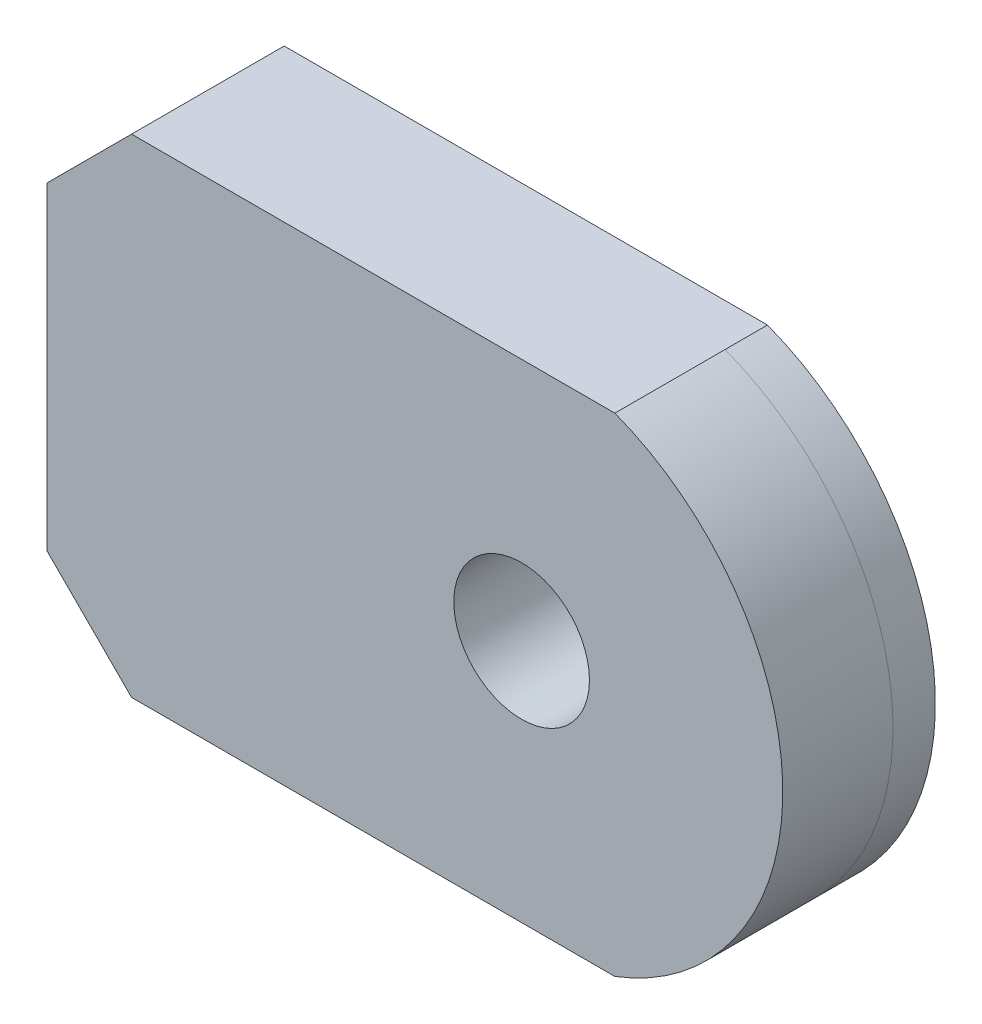
ISO-10303-21;
HEADER;
FILE_DESCRIPTION(('STEP AP214'),'2;1');
FILE_NAME('part.step','',(''),(''),'','','');
FILE_SCHEMA(('AUTOMOTIVE_DESIGN { 1 0 10303 214 1 1 1 1 }'));
ENDSEC;
DATA;
#1=APPLICATION_CONTEXT('core data for automotive mechanical design processes');
#2=APPLICATION_PROTOCOL_DEFINITION('international standard','automotive_design',2000,#1);
#3=PRODUCT_CONTEXT('',#1,'mechanical');
#4=PRODUCT('Part','Part','',(#3));
#5=PRODUCT_RELATED_PRODUCT_CATEGORY('part','',(#4));
#6=PRODUCT_DEFINITION_FORMATION('','',#4);
#7=PRODUCT_DEFINITION_CONTEXT('part definition',#1,'design');
#8=PRODUCT_DEFINITION('design','',#6,#7);
#9=PRODUCT_DEFINITION_SHAPE('','',#8);
#10=(LENGTH_UNIT() NAMED_UNIT(*) SI_UNIT(.MILLI.,.METRE.));
#11=(NAMED_UNIT(*) PLANE_ANGLE_UNIT() SI_UNIT($,.RADIAN.));
#12=(NAMED_UNIT(*) SI_UNIT($,.STERADIAN.) SOLID_ANGLE_UNIT());
#13=UNCERTAINTY_MEASURE_WITH_UNIT(LENGTH_MEASURE(1.E-05),#10,'distance_accuracy_value','');
#14=(GEOMETRIC_REPRESENTATION_CONTEXT(3) GLOBAL_UNCERTAINTY_ASSIGNED_CONTEXT((#13)) GLOBAL_UNIT_ASSIGNED_CONTEXT((#10,
#11,#12)) REPRESENTATION_CONTEXT('',''));
#15=CARTESIAN_POINT('',(0.,0.,0.));
#16=DIRECTION('',(0.,0.,1.));
#17=DIRECTION('',(1.,0.,0.));
#18=AXIS2_PLACEMENT_3D('',#15,#16,#17);
#19=CARTESIAN_POINT('',(28.,14.385,0.));
#20=DIRECTION('',(0.,0.,1.));
#21=DIRECTION('',(1.,0.,0.));
#22=AXIS2_PLACEMENT_3D('',#19,#20,#21);
#23=PLANE('',#22);
#24=DIRECTION('',(-0.707106781186547,-0.707106781186548,0.));
#25=VECTOR('',#24,1.);
#26=CARTESIAN_POINT('',(5.,28.77,0.));
#27=LINE('',#26,#25);
#28=CARTESIAN_POINT('',(5.,28.77,0.));
#29=VERTEX_POINT('',#28);
#30=CARTESIAN_POINT('',(0.,23.77,0.));
#31=VERTEX_POINT('',#30);
#32=EDGE_CURVE('E94',#29,#31,#27,.T.);
#33=ORIENTED_EDGE('',*,*,#32,.F.);
#34=DIRECTION('',(-1.,0.,0.));
#35=VECTOR('',#34,1.);
#36=CARTESIAN_POINT('',(22.5,28.77,0.));
#37=LINE('',#36,#35);
#38=CARTESIAN_POINT('',(33.5,28.77,0.));
#39=VERTEX_POINT('',#38);
#40=EDGE_CURVE('E78',#39,#29,#37,.T.);
#41=ORIENTED_EDGE('',*,*,#40,.F.);
#42=CARTESIAN_POINT('',(28.,14.385,0.));
#43=DIRECTION('',(0.,0.,1.));
#44=DIRECTION('',(1.,0.,0.));
#45=AXIS2_PLACEMENT_3D('',#42,#43,#44);
#46=CIRCLE('',#45,15.4005917094117);
#47=CARTESIAN_POINT('',(33.5,0.,0.));
#48=VERTEX_POINT('',#47);
#49=EDGE_CURVE('E88',#48,#39,#46,.T.);
#50=ORIENTED_EDGE('',*,*,#49,.F.);
#51=DIRECTION('',(1.,0.,0.));
#52=VECTOR('',#51,1.);
#53=CARTESIAN_POINT('',(22.5,0.,0.));
#54=LINE('',#53,#52);
#55=CARTESIAN_POINT('',(5.,0.,0.));
#56=VERTEX_POINT('',#55);
#57=EDGE_CURVE('E112',#56,#48,#54,.T.);
#58=ORIENTED_EDGE('',*,*,#57,.F.);
#59=DIRECTION('',(0.707106781186548,-0.707106781186547,0.));
#60=VECTOR('',#59,1.);
#61=CARTESIAN_POINT('',(0.,5.,0.));
#62=LINE('',#61,#60);
#63=CARTESIAN_POINT('',(0.,5.,0.));
#64=VERTEX_POINT('',#63);
#65=EDGE_CURVE('E103',#64,#56,#62,.T.);
#66=ORIENTED_EDGE('',*,*,#65,.F.);
#67=DIRECTION('',(0.,-1.,0.));
#68=VECTOR('',#67,1.);
#69=CARTESIAN_POINT('',(0.,23.77,0.));
#70=LINE('',#69,#68);
#71=EDGE_CURVE('E100',#31,#64,#70,.T.);
#72=ORIENTED_EDGE('',*,*,#71,.F.);
#73=EDGE_LOOP('',(#33,#41,#50,#58,#66,#72));
#74=FACE_BOUND('',#73,.T.);
#75=CARTESIAN_POINT('',(12.25,3.905,0.));
#76=DIRECTION('',(0.,0.,1.));
#77=DIRECTION('',(1.,0.,0.));
#78=AXIS2_PLACEMENT_3D('',#75,#76,#77);
#79=CIRCLE('',#78,1.98);
#80=CARTESIAN_POINT('',(14.23,3.905,0.));
#81=VERTEX_POINT('',#80);
#82=EDGE_CURVE('E101',#81,#81,#79,.T.);
#83=ORIENTED_EDGE('',*,*,#82,.T.);
#84=EDGE_LOOP('',(#83));
#85=FACE_BOUND('',#84,.T.);
#86=CARTESIAN_POINT('',(12.25,24.865,0.));
#87=DIRECTION('',(0.,0.,1.));
#88=DIRECTION('',(1.,0.,0.));
#89=AXIS2_PLACEMENT_3D('',#86,#87,#88);
#90=CIRCLE('',#89,1.98);
#91=CARTESIAN_POINT('',(14.23,24.865,0.));
#92=VERTEX_POINT('',#91);
#93=EDGE_CURVE('E106',#92,#92,#90,.T.);
#94=ORIENTED_EDGE('',*,*,#93,.T.);
#95=EDGE_LOOP('',(#94));
#96=FACE_BOUND('',#95,.T.);
#97=CARTESIAN_POINT('',(28.,14.385,0.));
#98=DIRECTION('',(0.,0.,1.));
#99=DIRECTION('',(1.,0.,0.));
#100=AXIS2_PLACEMENT_3D('',#97,#98,#99);
#101=CIRCLE('',#100,6.3);
#102=CARTESIAN_POINT('',(34.3,14.385,0.));
#103=VERTEX_POINT('',#102);
#104=EDGE_CURVE('E287',#103,#103,#101,.T.);
#105=ORIENTED_EDGE('',*,*,#104,.T.);
#106=EDGE_LOOP('',(#105));
#107=FACE_BOUND('',#106,.T.);
#108=CARTESIAN_POINT('',(28.,23.91,0.));
#109=DIRECTION('',(0.,0.,1.));
#110=DIRECTION('',(1.,0.,0.));
#111=AXIS2_PLACEMENT_3D('',#108,#109,#110);
#112=CIRCLE('',#111,1.475);
#113=CARTESIAN_POINT('',(29.475,23.91,0.));
#114=VERTEX_POINT('',#113);
#115=EDGE_CURVE('E284',#114,#114,#112,.T.);
#116=ORIENTED_EDGE('',*,*,#115,.T.);
#117=EDGE_LOOP('',(#116));
#118=FACE_BOUND('',#117,.T.);
#119=CARTESIAN_POINT('',(28.,4.86,0.));
#120=DIRECTION('',(0.,0.,1.));
#121=DIRECTION('',(1.,0.,0.));
#122=AXIS2_PLACEMENT_3D('',#119,#120,#121);
#123=CIRCLE('',#122,1.475);
#124=CARTESIAN_POINT('',(29.475,4.86,0.));
#125=VERTEX_POINT('',#124);
#126=EDGE_CURVE('E281',#125,#125,#123,.T.);
#127=ORIENTED_EDGE('',*,*,#126,.T.);
#128=EDGE_LOOP('',(#127));
#129=FACE_BOUND('',#128,.T.);
#130=CARTESIAN_POINT('',(36.9802561210691,5.40474387893083,0.));
#131=DIRECTION('',(0.,0.,1.));
#132=DIRECTION('',(1.,0.,0.));
#133=AXIS2_PLACEMENT_3D('',#130,#131,#132);
#134=CIRCLE('',#133,1.05);
#135=CARTESIAN_POINT('',(38.0302561210691,5.40474387893083,0.));
#136=VERTEX_POINT('',#135);
#137=EDGE_CURVE('E278',#136,#136,#134,.T.);
#138=ORIENTED_EDGE('',*,*,#137,.T.);
#139=EDGE_LOOP('',(#138));
#140=FACE_BOUND('',#139,.T.);
#141=CARTESIAN_POINT('',(36.9802561210691,23.3652561210692,0.));
#142=DIRECTION('',(0.,0.,1.));
#143=DIRECTION('',(1.,0.,0.));
#144=AXIS2_PLACEMENT_3D('',#141,#142,#143);
#145=CIRCLE('',#144,1.05);
#146=CARTESIAN_POINT('',(38.0302561210691,23.3652561210692,0.));
#147=VERTEX_POINT('',#146);
#148=EDGE_CURVE('E275',#147,#147,#145,.T.);
#149=ORIENTED_EDGE('',*,*,#148,.T.);
#150=EDGE_LOOP('',(#149));
#151=FACE_BOUND('',#150,.T.);
#152=CARTESIAN_POINT('',(19.0197438789308,23.3652561210692,0.));
#153=DIRECTION('',(0.,0.,1.));
#154=DIRECTION('',(1.,0.,0.));
#155=AXIS2_PLACEMENT_3D('',#152,#153,#154);
#156=CIRCLE('',#155,1.05);
#157=CARTESIAN_POINT('',(20.0697438789309,23.3652561210692,0.));
#158=VERTEX_POINT('',#157);
#159=EDGE_CURVE('E272',#158,#158,#156,.T.);
#160=ORIENTED_EDGE('',*,*,#159,.T.);
#161=EDGE_LOOP('',(#160));
#162=FACE_BOUND('',#161,.T.);
#163=CARTESIAN_POINT('',(19.0197438789308,5.40474387893083,0.));
#164=DIRECTION('',(0.,0.,1.));
#165=DIRECTION('',(1.,0.,0.));
#166=AXIS2_PLACEMENT_3D('',#163,#164,#165);
#167=CIRCLE('',#166,1.05);
#168=CARTESIAN_POINT('',(20.0697438789309,5.40474387893083,0.));
#169=VERTEX_POINT('',#168);
#170=EDGE_CURVE('E269',#169,#169,#167,.T.);
#171=ORIENTED_EDGE('',*,*,#170,.T.);
#172=EDGE_LOOP('',(#171));
#173=FACE_BOUND('',#172,.T.);
#174=CARTESIAN_POINT('',(24.,21.3132032302755,0.));
#175=DIRECTION('',(0.,0.,1.));
#176=DIRECTION('',(1.,0.,0.));
#177=AXIS2_PLACEMENT_3D('',#174,#175,#176);
#178=CIRCLE('',#177,0.85);
#179=CARTESIAN_POINT('',(24.85,21.3132032302755,0.));
#180=VERTEX_POINT('',#179);
#181=EDGE_CURVE('E266',#180,#180,#178,.T.);
#182=ORIENTED_EDGE('',*,*,#181,.T.);
#183=EDGE_LOOP('',(#182));
#184=FACE_BOUND('',#183,.T.);
#185=CARTESIAN_POINT('',(32.,7.45679676972446,0.));
#186=DIRECTION('',(0.,0.,1.));
#187=DIRECTION('',(1.,0.,0.));
#188=AXIS2_PLACEMENT_3D('',#185,#186,#187);
#189=CIRCLE('',#188,0.85);
#190=CARTESIAN_POINT('',(32.85,7.45679676972446,0.));
#191=VERTEX_POINT('',#190);
#192=EDGE_CURVE('E263',#191,#191,#189,.T.);
#193=ORIENTED_EDGE('',*,*,#192,.T.);
#194=EDGE_LOOP('',(#193));
#195=FACE_BOUND('',#194,.T.);
#196=ADVANCED_FACE('F35',(#74,#85,#96,#107,#118,#129,#140,#151,#162,#173,#184,#195),#23,.F.);
#197=CARTESIAN_POINT('',(5.,28.77,2.5));
#198=DIRECTION('',(0.707106781186548,-0.707106781186547,0.));
#199=DIRECTION('',(0.707106781186547,0.707106781186548,0.));
#200=AXIS2_PLACEMENT_3D('',#197,#198,#199);
#201=PLANE('',#200);
#202=ORIENTED_EDGE('',*,*,#32,.T.);
#203=DIRECTION('',(0.,0.,-1.));
#204=VECTOR('',#203,1.);
#205=CARTESIAN_POINT('',(0.,23.77,2.5));
#206=LINE('',#205,#204);
#207=CARTESIAN_POINT('',(0.,23.77,9.));
#208=VERTEX_POINT('',#207);
#209=EDGE_CURVE('E11',#208,#31,#206,.T.);
#210=ORIENTED_EDGE('',*,*,#209,.F.);
#211=DIRECTION('',(-0.707106781186547,-0.707106781186548,0.));
#212=VECTOR('',#211,1.);
#213=CARTESIAN_POINT('',(5.,28.77,9.));
#214=LINE('',#213,#212);
#215=CARTESIAN_POINT('',(5.,28.77,9.));
#216=VERTEX_POINT('',#215);
#217=EDGE_CURVE('E96',#216,#208,#214,.T.);
#218=ORIENTED_EDGE('',*,*,#217,.F.);
#219=DIRECTION('',(0.,0.,-1.));
#220=VECTOR('',#219,1.);
#221=CARTESIAN_POINT('',(5.,28.77,2.5));
#222=LINE('',#221,#220);
#223=EDGE_CURVE('E84',#216,#29,#222,.T.);
#224=ORIENTED_EDGE('',*,*,#223,.T.);
#225=EDGE_LOOP('',(#202,#210,#218,#224));
#226=FACE_BOUND('',#225,.T.);
#227=ADVANCED_FACE('F37',(#226),#201,.F.);
#228=CARTESIAN_POINT('',(0.,23.77,2.5));
#229=DIRECTION('',(1.,0.,0.));
#230=DIRECTION('',(0.,1.,0.));
#231=AXIS2_PLACEMENT_3D('',#228,#229,#230);
#232=PLANE('',#231);
#233=ORIENTED_EDGE('',*,*,#71,.T.);
#234=DIRECTION('',(0.,0.,-1.));
#235=VECTOR('',#234,1.);
#236=CARTESIAN_POINT('',(0.,5.,2.5));
#237=LINE('',#236,#235);
#238=CARTESIAN_POINT('',(0.,5.,9.));
#239=VERTEX_POINT('',#238);
#240=EDGE_CURVE('E45',#239,#64,#237,.T.);
#241=ORIENTED_EDGE('',*,*,#240,.F.);
#242=DIRECTION('',(0.,-1.,0.));
#243=VECTOR('',#242,1.);
#244=CARTESIAN_POINT('',(0.,5.,9.));
#245=LINE('',#244,#243);
#246=EDGE_CURVE('E390',#208,#239,#245,.T.);
#247=ORIENTED_EDGE('',*,*,#246,.F.);
#248=ORIENTED_EDGE('',*,*,#209,.T.);
#249=EDGE_LOOP('',(#233,#241,#247,#248));
#250=FACE_BOUND('',#249,.T.);
#251=ADVANCED_FACE('F146',(#250),#232,.F.);
#252=CARTESIAN_POINT('',(0.,5.,2.5));
#253=DIRECTION('',(0.707106781186547,0.707106781186548,0.));
#254=DIRECTION('',(-0.707106781186548,0.707106781186547,0.));
#255=AXIS2_PLACEMENT_3D('',#252,#253,#254);
#256=PLANE('',#255);
#257=ORIENTED_EDGE('',*,*,#65,.T.);
#258=DIRECTION('',(0.,0.,-1.));
#259=VECTOR('',#258,1.);
#260=CARTESIAN_POINT('',(5.,0.,2.5));
#261=LINE('',#260,#259);
#262=CARTESIAN_POINT('',(5.,0.,9.));
#263=VERTEX_POINT('',#262);
#264=EDGE_CURVE('E115',#263,#56,#261,.T.);
#265=ORIENTED_EDGE('',*,*,#264,.F.);
#266=DIRECTION('',(0.707106781186548,-0.707106781186547,0.));
#267=VECTOR('',#266,1.);
#268=CARTESIAN_POINT('',(5.,0.,9.));
#269=LINE('',#268,#267);
#270=EDGE_CURVE('E397',#239,#263,#269,.T.);
#271=ORIENTED_EDGE('',*,*,#270,.F.);
#272=ORIENTED_EDGE('',*,*,#240,.T.);
#273=EDGE_LOOP('',(#257,#265,#271,#272));
#274=FACE_BOUND('',#273,.T.);
#275=ADVANCED_FACE('F143',(#274),#256,.F.);
#276=CARTESIAN_POINT('',(22.5,0.,2.5));
#277=DIRECTION('',(0.,1.,0.));
#278=DIRECTION('',(0.,0.,1.));
#279=AXIS2_PLACEMENT_3D('',#276,#277,#278);
#280=PLANE('',#279);
#281=ORIENTED_EDGE('',*,*,#57,.T.);
#282=DIRECTION('',(0.,0.,-1.));
#283=VECTOR('',#282,1.);
#284=CARTESIAN_POINT('',(33.5,0.,2.5));
#285=LINE('',#284,#283);
#286=CARTESIAN_POINT('',(33.5,0.,2.5));
#287=VERTEX_POINT('',#286);
#288=EDGE_CURVE('E118',#287,#48,#285,.T.);
#289=ORIENTED_EDGE('',*,*,#288,.F.);
#290=DIRECTION('',(0.,0.,-1.));
#291=VECTOR('',#290,1.);
#292=CARTESIAN_POINT('',(33.5,0.,9.));
#293=LINE('',#292,#291);
#294=CARTESIAN_POINT('',(33.5,0.,9.));
#295=VERTEX_POINT('',#294);
#296=EDGE_CURVE('E216',#295,#287,#293,.T.);
#297=ORIENTED_EDGE('',*,*,#296,.F.);
#298=DIRECTION('',(1.,0.,0.));
#299=VECTOR('',#298,1.);
#300=CARTESIAN_POINT('',(33.5,0.,9.));
#301=LINE('',#300,#299);
#302=EDGE_CURVE('E400',#263,#295,#301,.T.);
#303=ORIENTED_EDGE('',*,*,#302,.F.);
#304=ORIENTED_EDGE('',*,*,#264,.T.);
#305=EDGE_LOOP('',(#281,#289,#297,#303,#304));
#306=FACE_BOUND('',#305,.T.);
#307=ADVANCED_FACE('F139',(#306),#280,.F.);
#308=CARTESIAN_POINT('',(28.,14.385,2.5));
#309=DIRECTION('',(0.,0.,-1.));
#310=DIRECTION('',(-1.,0.,0.));
#311=AXIS2_PLACEMENT_3D('',#308,#309,#310);
#312=CYLINDRICAL_SURFACE('',#311,15.4005917094117);
#313=ORIENTED_EDGE('',*,*,#49,.T.);
#314=DIRECTION('',(0.,0.,-1.));
#315=VECTOR('',#314,1.);
#316=CARTESIAN_POINT('',(33.5,28.77,2.5));
#317=LINE('',#316,#315);
#318=CARTESIAN_POINT('',(33.5,28.77,2.5));
#319=VERTEX_POINT('',#318);
#320=EDGE_CURVE('E54',#319,#39,#317,.T.);
#321=ORIENTED_EDGE('',*,*,#320,.F.);
#322=CARTESIAN_POINT('',(27.9998466553482,14.385,2.5));
#323=DIRECTION('',(0.,0.,1.));
#324=DIRECTION('',(0.357137822361272,-0.934051698697159,0.));
#325=AXIS2_PLACEMENT_3D('',#322,#323,#324);
#326=CIRCLE('',#325,15.4006464739207);
#327=EDGE_CURVE('E87',#287,#319,#326,.T.);
#328=ORIENTED_EDGE('',*,*,#327,.F.);
#329=ORIENTED_EDGE('',*,*,#288,.T.);
#330=EDGE_LOOP('',(#313,#321,#328,#329));
#331=FACE_BOUND('',#330,.T.);
#332=ADVANCED_FACE('F129',(#331),#312,.T.);
#333=CARTESIAN_POINT('',(22.5,28.77,2.5));
#334=DIRECTION('',(0.,-1.,0.));
#335=DIRECTION('',(0.,0.,-1.));
#336=AXIS2_PLACEMENT_3D('',#333,#334,#335);
#337=PLANE('',#336);
#338=ORIENTED_EDGE('',*,*,#40,.T.);
#339=ORIENTED_EDGE('',*,*,#223,.F.);
#340=DIRECTION('',(-1.,0.,0.));
#341=VECTOR('',#340,1.);
#342=CARTESIAN_POINT('',(5.,28.77,9.));
#343=LINE('',#342,#341);
#344=CARTESIAN_POINT('',(33.5,28.77,9.));
#345=VERTEX_POINT('',#344);
#346=EDGE_CURVE('E228',#345,#216,#343,.T.);
#347=ORIENTED_EDGE('',*,*,#346,.F.);
#348=DIRECTION('',(0.,0.,-1.));
#349=VECTOR('',#348,1.);
#350=CARTESIAN_POINT('',(33.5,28.77,9.));
#351=LINE('',#350,#349);
#352=EDGE_CURVE('E224',#345,#319,#351,.T.);
#353=ORIENTED_EDGE('',*,*,#352,.T.);
#354=ORIENTED_EDGE('',*,*,#320,.T.);
#355=EDGE_LOOP('',(#338,#339,#347,#353,#354));
#356=FACE_BOUND('',#355,.T.);
#357=ADVANCED_FACE('F82',(#356),#337,.F.);
#358=CARTESIAN_POINT('',(12.25,3.905,2.5));
#359=DIRECTION('',(0.,0.,-1.));
#360=DIRECTION('',(-1.,0.,0.));
#361=AXIS2_PLACEMENT_3D('',#358,#359,#360);
#362=CYLINDRICAL_SURFACE('',#361,1.98);
#363=CARTESIAN_POINT('',(12.25,3.905,2.5));
#364=DIRECTION('',(0.,0.,-1.));
#365=DIRECTION('',(-1.,0.,0.));
#366=AXIS2_PLACEMENT_3D('',#363,#364,#365);
#367=CIRCLE('',#366,1.98);
#368=CARTESIAN_POINT('',(10.27,3.905,2.5));
#369=VERTEX_POINT('',#368);
#370=EDGE_CURVE('E260',#369,#369,#367,.T.);
#371=ORIENTED_EDGE('',*,*,#370,.F.);
#372=EDGE_LOOP('',(#371));
#373=FACE_BOUND('',#372,.T.);
#374=ORIENTED_EDGE('',*,*,#82,.F.);
#375=EDGE_LOOP('',(#374));
#376=FACE_BOUND('',#375,.T.);
#377=ADVANCED_FACE('F157',(#373,#376),#362,.F.);
#378=CARTESIAN_POINT('',(12.25,24.865,2.5));
#379=DIRECTION('',(0.,0.,-1.));
#380=DIRECTION('',(-1.,0.,0.));
#381=AXIS2_PLACEMENT_3D('',#378,#379,#380);
#382=CYLINDRICAL_SURFACE('',#381,1.98);
#383=CARTESIAN_POINT('',(12.25,24.865,2.5));
#384=DIRECTION('',(0.,0.,-1.));
#385=DIRECTION('',(-1.,0.,0.));
#386=AXIS2_PLACEMENT_3D('',#383,#384,#385);
#387=CIRCLE('',#386,1.98);
#388=CARTESIAN_POINT('',(10.27,24.865,2.5));
#389=VERTEX_POINT('',#388);
#390=EDGE_CURVE('E257',#389,#389,#387,.T.);
#391=ORIENTED_EDGE('',*,*,#390,.F.);
#392=EDGE_LOOP('',(#391));
#393=FACE_BOUND('',#392,.T.);
#394=ORIENTED_EDGE('',*,*,#93,.F.);
#395=EDGE_LOOP('',(#394));
#396=FACE_BOUND('',#395,.T.);
#397=ADVANCED_FACE('F160',(#393,#396),#382,.F.);
#398=CARTESIAN_POINT('',(28.,14.385,2.5));
#399=DIRECTION('',(0.,0.,-1.));
#400=DIRECTION('',(-1.,0.,0.));
#401=AXIS2_PLACEMENT_3D('',#398,#399,#400);
#402=CYLINDRICAL_SURFACE('',#401,6.3);
#403=CARTESIAN_POINT('',(28.,14.385,2.5));
#404=DIRECTION('',(0.,0.,-1.));
#405=DIRECTION('',(-1.,0.,0.));
#406=AXIS2_PLACEMENT_3D('',#403,#404,#405);
#407=CIRCLE('',#406,6.3);
#408=CARTESIAN_POINT('',(21.7,14.385,2.5));
#409=VERTEX_POINT('',#408);
#410=EDGE_CURVE('E254',#409,#409,#407,.T.);
#411=ORIENTED_EDGE('',*,*,#410,.F.);
#412=EDGE_LOOP('',(#411));
#413=FACE_BOUND('',#412,.T.);
#414=ORIENTED_EDGE('',*,*,#104,.F.);
#415=EDGE_LOOP('',(#414));
#416=FACE_BOUND('',#415,.T.);
#417=ADVANCED_FACE('F164',(#413,#416),#402,.F.);
#418=CARTESIAN_POINT('',(28.,23.91,2.5));
#419=DIRECTION('',(0.,0.,-1.));
#420=DIRECTION('',(-1.,0.,0.));
#421=AXIS2_PLACEMENT_3D('',#418,#419,#420);
#422=CYLINDRICAL_SURFACE('',#421,1.475);
#423=CARTESIAN_POINT('',(28.,23.91,2.5));
#424=DIRECTION('',(0.,0.,-1.));
#425=DIRECTION('',(-1.,0.,0.));
#426=AXIS2_PLACEMENT_3D('',#423,#424,#425);
#427=CIRCLE('',#426,1.475);
#428=CARTESIAN_POINT('',(26.525,23.91,2.5));
#429=VERTEX_POINT('',#428);
#430=EDGE_CURVE('E251',#429,#429,#427,.T.);
#431=ORIENTED_EDGE('',*,*,#430,.F.);
#432=EDGE_LOOP('',(#431));
#433=FACE_BOUND('',#432,.T.);
#434=ORIENTED_EDGE('',*,*,#115,.F.);
#435=EDGE_LOOP('',(#434));
#436=FACE_BOUND('',#435,.T.);
#437=ADVANCED_FACE('F168',(#433,#436),#422,.F.);
#438=CARTESIAN_POINT('',(28.,4.86,2.5));
#439=DIRECTION('',(0.,0.,-1.));
#440=DIRECTION('',(-1.,0.,0.));
#441=AXIS2_PLACEMENT_3D('',#438,#439,#440);
#442=CYLINDRICAL_SURFACE('',#441,1.475);
#443=CARTESIAN_POINT('',(28.,4.86,2.5));
#444=DIRECTION('',(0.,0.,-1.));
#445=DIRECTION('',(-1.,0.,0.));
#446=AXIS2_PLACEMENT_3D('',#443,#444,#445);
#447=CIRCLE('',#446,1.475);
#448=CARTESIAN_POINT('',(26.525,4.86,2.5));
#449=VERTEX_POINT('',#448);
#450=EDGE_CURVE('E248',#449,#449,#447,.T.);
#451=ORIENTED_EDGE('',*,*,#450,.F.);
#452=EDGE_LOOP('',(#451));
#453=FACE_BOUND('',#452,.T.);
#454=ORIENTED_EDGE('',*,*,#126,.F.);
#455=EDGE_LOOP('',(#454));
#456=FACE_BOUND('',#455,.T.);
#457=ADVANCED_FACE('F172',(#453,#456),#442,.F.);
#458=CARTESIAN_POINT('',(36.9802561210691,5.40474387893083,2.5));
#459=DIRECTION('',(0.,0.,-1.));
#460=DIRECTION('',(-1.,0.,0.));
#461=AXIS2_PLACEMENT_3D('',#458,#459,#460);
#462=CYLINDRICAL_SURFACE('',#461,1.05);
#463=CARTESIAN_POINT('',(36.9802561210691,5.40474387893083,2.5));
#464=DIRECTION('',(0.,0.,-1.));
#465=DIRECTION('',(-1.,0.,0.));
#466=AXIS2_PLACEMENT_3D('',#463,#464,#465);
#467=CIRCLE('',#466,1.05);
#468=CARTESIAN_POINT('',(35.9302561210691,5.40474387893083,2.5));
#469=VERTEX_POINT('',#468);
#470=EDGE_CURVE('E245',#469,#469,#467,.T.);
#471=ORIENTED_EDGE('',*,*,#470,.F.);
#472=EDGE_LOOP('',(#471));
#473=FACE_BOUND('',#472,.T.);
#474=ORIENTED_EDGE('',*,*,#137,.F.);
#475=EDGE_LOOP('',(#474));
#476=FACE_BOUND('',#475,.T.);
#477=ADVANCED_FACE('F176',(#473,#476),#462,.F.);
#478=CARTESIAN_POINT('',(36.9802561210691,23.3652561210692,2.5));
#479=DIRECTION('',(0.,0.,-1.));
#480=DIRECTION('',(-1.,0.,0.));
#481=AXIS2_PLACEMENT_3D('',#478,#479,#480);
#482=CYLINDRICAL_SURFACE('',#481,1.05);
#483=CARTESIAN_POINT('',(36.9802561210691,23.3652561210692,2.5));
#484=DIRECTION('',(0.,0.,-1.));
#485=DIRECTION('',(-1.,0.,0.));
#486=AXIS2_PLACEMENT_3D('',#483,#484,#485);
#487=CIRCLE('',#486,1.05);
#488=CARTESIAN_POINT('',(35.9302561210691,23.3652561210692,2.5));
#489=VERTEX_POINT('',#488);
#490=EDGE_CURVE('E242',#489,#489,#487,.T.);
#491=ORIENTED_EDGE('',*,*,#490,.F.);
#492=EDGE_LOOP('',(#491));
#493=FACE_BOUND('',#492,.T.);
#494=ORIENTED_EDGE('',*,*,#148,.F.);
#495=EDGE_LOOP('',(#494));
#496=FACE_BOUND('',#495,.T.);
#497=ADVANCED_FACE('F180',(#493,#496),#482,.F.);
#498=CARTESIAN_POINT('',(19.0197438789308,23.3652561210692,2.5));
#499=DIRECTION('',(0.,0.,-1.));
#500=DIRECTION('',(-1.,0.,0.));
#501=AXIS2_PLACEMENT_3D('',#498,#499,#500);
#502=CYLINDRICAL_SURFACE('',#501,1.05);
#503=CARTESIAN_POINT('',(19.0197438789308,23.3652561210692,2.5));
#504=DIRECTION('',(0.,0.,-1.));
#505=DIRECTION('',(-1.,0.,0.));
#506=AXIS2_PLACEMENT_3D('',#503,#504,#505);
#507=CIRCLE('',#506,1.05);
#508=CARTESIAN_POINT('',(17.9697438789309,23.3652561210692,2.5));
#509=VERTEX_POINT('',#508);
#510=EDGE_CURVE('E239',#509,#509,#507,.T.);
#511=ORIENTED_EDGE('',*,*,#510,.F.);
#512=EDGE_LOOP('',(#511));
#513=FACE_BOUND('',#512,.T.);
#514=ORIENTED_EDGE('',*,*,#159,.F.);
#515=EDGE_LOOP('',(#514));
#516=FACE_BOUND('',#515,.T.);
#517=ADVANCED_FACE('F184',(#513,#516),#502,.F.);
#518=CARTESIAN_POINT('',(19.0197438789308,5.40474387893083,2.5));
#519=DIRECTION('',(0.,0.,-1.));
#520=DIRECTION('',(-1.,0.,0.));
#521=AXIS2_PLACEMENT_3D('',#518,#519,#520);
#522=CYLINDRICAL_SURFACE('',#521,1.05);
#523=CARTESIAN_POINT('',(19.0197438789308,5.40474387893083,2.5));
#524=DIRECTION('',(0.,0.,-1.));
#525=DIRECTION('',(-1.,0.,0.));
#526=AXIS2_PLACEMENT_3D('',#523,#524,#525);
#527=CIRCLE('',#526,1.05);
#528=CARTESIAN_POINT('',(17.9697438789308,5.40474387893083,2.5));
#529=VERTEX_POINT('',#528);
#530=EDGE_CURVE('E236',#529,#529,#527,.T.);
#531=ORIENTED_EDGE('',*,*,#530,.F.);
#532=EDGE_LOOP('',(#531));
#533=FACE_BOUND('',#532,.T.);
#534=ORIENTED_EDGE('',*,*,#170,.F.);
#535=EDGE_LOOP('',(#534));
#536=FACE_BOUND('',#535,.T.);
#537=ADVANCED_FACE('F188',(#533,#536),#522,.F.);
#538=CARTESIAN_POINT('',(24.,21.3132032302755,2.5));
#539=DIRECTION('',(0.,0.,-1.));
#540=DIRECTION('',(-1.,0.,0.));
#541=AXIS2_PLACEMENT_3D('',#538,#539,#540);
#542=CYLINDRICAL_SURFACE('',#541,0.85);
#543=CARTESIAN_POINT('',(24.,21.3132032302755,2.5));
#544=DIRECTION('',(0.,0.,-1.));
#545=DIRECTION('',(-1.,0.,0.));
#546=AXIS2_PLACEMENT_3D('',#543,#544,#545);
#547=CIRCLE('',#546,0.85);
#548=CARTESIAN_POINT('',(23.15,21.3132032302755,2.5));
#549=VERTEX_POINT('',#548);
#550=EDGE_CURVE('E233',#549,#549,#547,.T.);
#551=ORIENTED_EDGE('',*,*,#550,.F.);
#552=EDGE_LOOP('',(#551));
#553=FACE_BOUND('',#552,.T.);
#554=ORIENTED_EDGE('',*,*,#181,.F.);
#555=EDGE_LOOP('',(#554));
#556=FACE_BOUND('',#555,.T.);
#557=ADVANCED_FACE('F192',(#553,#556),#542,.F.);
#558=CARTESIAN_POINT('',(32.,7.45679676972446,2.5));
#559=DIRECTION('',(0.,0.,-1.));
#560=DIRECTION('',(-1.,0.,0.));
#561=AXIS2_PLACEMENT_3D('',#558,#559,#560);
#562=CYLINDRICAL_SURFACE('',#561,0.85);
#563=CARTESIAN_POINT('',(32.,7.45679676972446,2.5));
#564=DIRECTION('',(0.,0.,-1.));
#565=DIRECTION('',(-1.,0.,0.));
#566=AXIS2_PLACEMENT_3D('',#563,#564,#565);
#567=CIRCLE('',#566,0.85);
#568=CARTESIAN_POINT('',(31.15,7.45679676972446,2.5));
#569=VERTEX_POINT('',#568);
#570=EDGE_CURVE('E223',#569,#569,#567,.T.);
#571=ORIENTED_EDGE('',*,*,#570,.F.);
#572=EDGE_LOOP('',(#571));
#573=FACE_BOUND('',#572,.T.);
#574=ORIENTED_EDGE('',*,*,#192,.F.);
#575=EDGE_LOOP('',(#574));
#576=FACE_BOUND('',#575,.T.);
#577=ADVANCED_FACE('F196',(#573,#576),#562,.F.);
#578=CARTESIAN_POINT('',(27.9998466553482,14.385,2.5));
#579=DIRECTION('',(0.,0.,-1.));
#580=DIRECTION('',(-1.,0.,0.));
#581=AXIS2_PLACEMENT_3D('',#578,#579,#580);
#582=PLANE('',#581);
#583=ORIENTED_EDGE('',*,*,#570,.T.);
#584=EDGE_LOOP('',(#583));
#585=FACE_BOUND('',#584,.T.);
#586=ADVANCED_FACE('F200',(#585),#582,.T.);
#587=ORIENTED_EDGE('',*,*,#550,.T.);
#588=EDGE_LOOP('',(#587));
#589=FACE_BOUND('',#588,.T.);
#590=ADVANCED_FACE('F332',(#589),#582,.T.);
#591=ORIENTED_EDGE('',*,*,#530,.T.);
#592=EDGE_LOOP('',(#591));
#593=FACE_BOUND('',#592,.T.);
#594=ADVANCED_FACE('F337',(#593),#582,.T.);
#595=ORIENTED_EDGE('',*,*,#510,.T.);
#596=EDGE_LOOP('',(#595));
#597=FACE_BOUND('',#596,.T.);
#598=ADVANCED_FACE('F343',(#597),#582,.T.);
#599=ORIENTED_EDGE('',*,*,#490,.T.);
#600=EDGE_LOOP('',(#599));
#601=FACE_BOUND('',#600,.T.);
#602=ADVANCED_FACE('F349',(#601),#582,.T.);
#603=ORIENTED_EDGE('',*,*,#470,.T.);
#604=EDGE_LOOP('',(#603));
#605=FACE_BOUND('',#604,.T.);
#606=ADVANCED_FACE('F355',(#605),#582,.T.);
#607=ORIENTED_EDGE('',*,*,#450,.T.);
#608=EDGE_LOOP('',(#607));
#609=FACE_BOUND('',#608,.T.);
#610=ADVANCED_FACE('F361',(#609),#582,.T.);
#611=ORIENTED_EDGE('',*,*,#430,.T.);
#612=EDGE_LOOP('',(#611));
#613=FACE_BOUND('',#612,.T.);
#614=ADVANCED_FACE('F367',(#613),#582,.T.);
#615=CARTESIAN_POINT('',(27.9998466553482,14.385,2.5));
#616=DIRECTION('',(0.,0.,-1.));
#617=DIRECTION('',(-1.,0.,0.));
#618=AXIS2_PLACEMENT_3D('',#615,#616,#617);
#619=CIRCLE('',#618,4.);
#620=CARTESIAN_POINT('',(23.9998466553482,14.385,2.5));
#621=VERTEX_POINT('',#620);
#622=EDGE_CURVE('E385',#621,#621,#619,.T.);
#623=ORIENTED_EDGE('',*,*,#622,.F.);
#624=EDGE_LOOP('',(#623));
#625=FACE_BOUND('',#624,.T.);
#626=ORIENTED_EDGE('',*,*,#410,.T.);
#627=EDGE_LOOP('',(#626));
#628=FACE_BOUND('',#627,.T.);
#629=ADVANCED_FACE('F329',(#625,#628),#582,.T.);
#630=ORIENTED_EDGE('',*,*,#390,.T.);
#631=EDGE_LOOP('',(#630));
#632=FACE_BOUND('',#631,.T.);
#633=ADVANCED_FACE('F325',(#632),#582,.T.);
#634=ORIENTED_EDGE('',*,*,#370,.T.);
#635=EDGE_LOOP('',(#634));
#636=FACE_BOUND('',#635,.T.);
#637=ADVANCED_FACE('F207',(#636),#582,.T.);
#638=CARTESIAN_POINT('',(27.9998466553482,14.385,9.));
#639=DIRECTION('',(0.,0.,-1.));
#640=DIRECTION('',(-1.,0.,0.));
#641=AXIS2_PLACEMENT_3D('',#638,#639,#640);
#642=CYLINDRICAL_SURFACE('',#641,15.4006464739207);
#643=ORIENTED_EDGE('',*,*,#327,.T.);
#644=ORIENTED_EDGE('',*,*,#352,.F.);
#645=CARTESIAN_POINT('',(27.9998466553482,14.385,9.));
#646=DIRECTION('',(0.,0.,1.));
#647=DIRECTION('',(-1.,0.,0.));
#648=AXIS2_PLACEMENT_3D('',#645,#646,#647);
#649=CIRCLE('',#648,15.4006464739207);
#650=EDGE_CURVE('E403',#295,#345,#649,.T.);
#651=ORIENTED_EDGE('',*,*,#650,.F.);
#652=ORIENTED_EDGE('',*,*,#296,.T.);
#653=EDGE_LOOP('',(#643,#644,#651,#652));
#654=FACE_BOUND('',#653,.T.);
#655=ADVANCED_FACE('F202',(#654),#642,.T.);
#656=CARTESIAN_POINT('',(27.9998466553482,14.385,9.));
#657=DIRECTION('',(0.,0.,-1.));
#658=DIRECTION('',(-1.,0.,0.));
#659=AXIS2_PLACEMENT_3D('',#656,#657,#658);
#660=PLANE('',#659);
#661=CARTESIAN_POINT('',(27.9998466553482,14.385,9.));
#662=DIRECTION('',(0.,0.,1.));
#663=DIRECTION('',(1.,0.,0.));
#664=AXIS2_PLACEMENT_3D('',#661,#662,#663);
#665=CIRCLE('',#664,4.);
#666=CARTESIAN_POINT('',(31.9998466553482,14.385,9.));
#667=VERTEX_POINT('',#666);
#668=EDGE_CURVE('E388',#667,#667,#665,.T.);
#669=ORIENTED_EDGE('',*,*,#668,.F.);
#670=EDGE_LOOP('',(#669));
#671=FACE_BOUND('',#670,.T.);
#672=ORIENTED_EDGE('',*,*,#217,.T.);
#673=ORIENTED_EDGE('',*,*,#246,.T.);
#674=ORIENTED_EDGE('',*,*,#270,.T.);
#675=ORIENTED_EDGE('',*,*,#302,.T.);
#676=ORIENTED_EDGE('',*,*,#650,.T.);
#677=ORIENTED_EDGE('',*,*,#346,.T.);
#678=EDGE_LOOP('',(#672,#673,#674,#675,#676,#677));
#679=FACE_BOUND('',#678,.T.);
#680=ADVANCED_FACE('F206',(#671,#679),#660,.F.);
#681=CARTESIAN_POINT('',(27.9998466553482,14.385,-1.));
#682=DIRECTION('',(0.,0.,1.));
#683=DIRECTION('',(1.,0.,0.));
#684=AXIS2_PLACEMENT_3D('',#681,#682,#683);
#685=CYLINDRICAL_SURFACE('',#684,4.);
#686=ORIENTED_EDGE('',*,*,#622,.T.);
#687=EDGE_LOOP('',(#686));
#688=FACE_BOUND('',#687,.T.);
#689=ORIENTED_EDGE('',*,*,#668,.T.);
#690=EDGE_LOOP('',(#689));
#691=FACE_BOUND('',#690,.T.);
#692=ADVANCED_FACE('F426',(#688,#691),#685,.F.);
#693=CLOSED_SHELL('',(#196,#227,#251,#275,#307,#332,#357,#377,#397,#417,#437,#457,#477,#497,
#517,#537,#557,#577,#586,#590,#594,#598,#602,#606,#610,#614,#629,#633,#637,#655,#680,#692));
#694=MANIFOLD_SOLID_BREP('B2',#693);
#695=ADVANCED_BREP_SHAPE_REPRESENTATION('',(#18,#694),#14);
#696=SHAPE_DEFINITION_REPRESENTATION(#9,#695);
ENDSEC;
END-ISO-10303-21;
